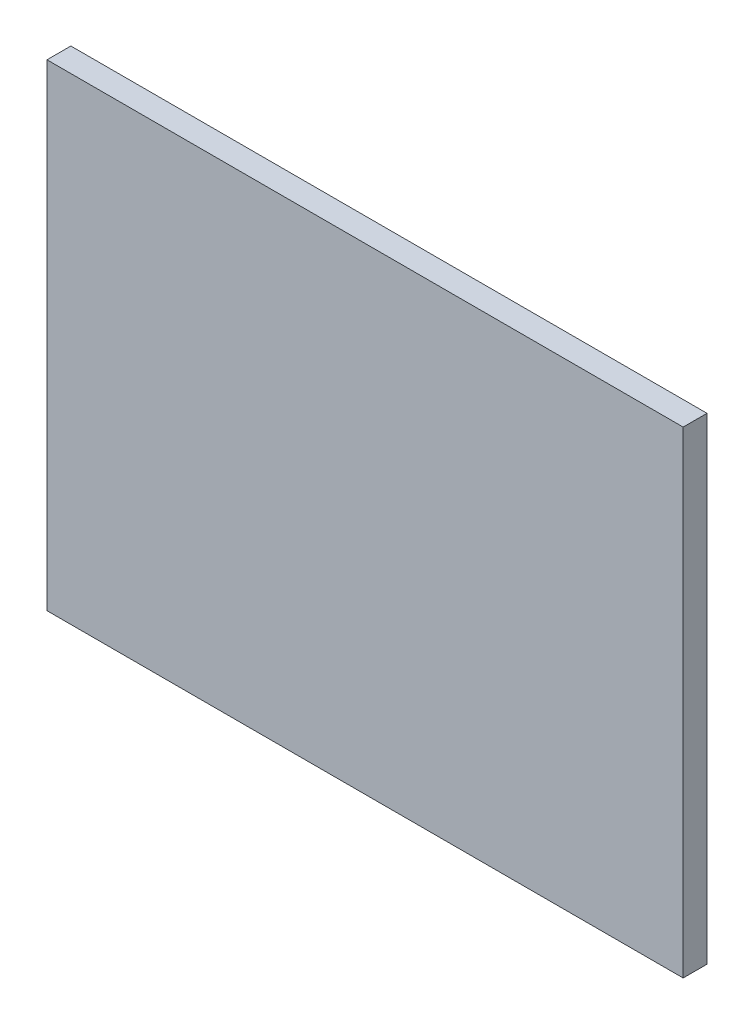
ISO-10303-21;
HEADER;
FILE_DESCRIPTION(('STEP AP214'),'2;1');
FILE_NAME('part.step','',(''),(''),'','','');
FILE_SCHEMA(('AUTOMOTIVE_DESIGN { 1 0 10303 214 1 1 1 1 }'));
ENDSEC;
DATA;
#1=APPLICATION_CONTEXT('core data for automotive mechanical design processes');
#2=APPLICATION_PROTOCOL_DEFINITION('international standard','automotive_design',2000,#1);
#3=PRODUCT_CONTEXT('',#1,'mechanical');
#4=PRODUCT('Part','Part','',(#3));
#5=PRODUCT_RELATED_PRODUCT_CATEGORY('part','',(#4));
#6=PRODUCT_DEFINITION_FORMATION('','',#4);
#7=PRODUCT_DEFINITION_CONTEXT('part definition',#1,'design');
#8=PRODUCT_DEFINITION('design','',#6,#7);
#9=PRODUCT_DEFINITION_SHAPE('','',#8);
#10=(LENGTH_UNIT() NAMED_UNIT(*) SI_UNIT(.MILLI.,.METRE.));
#11=(NAMED_UNIT(*) PLANE_ANGLE_UNIT() SI_UNIT($,.RADIAN.));
#12=(NAMED_UNIT(*) SI_UNIT($,.STERADIAN.) SOLID_ANGLE_UNIT());
#13=UNCERTAINTY_MEASURE_WITH_UNIT(LENGTH_MEASURE(1.E-05),#10,'distance_accuracy_value','');
#14=(GEOMETRIC_REPRESENTATION_CONTEXT(3) GLOBAL_UNCERTAINTY_ASSIGNED_CONTEXT((#13)) GLOBAL_UNIT_ASSIGNED_CONTEXT((#10,
#11,#12)) REPRESENTATION_CONTEXT('',''));
#15=CARTESIAN_POINT('',(0.,0.,0.));
#16=DIRECTION('',(0.,0.,1.));
#17=DIRECTION('',(1.,0.,0.));
#18=AXIS2_PLACEMENT_3D('',#15,#16,#17);
#19=CARTESIAN_POINT('',(-67.0187252741451,-15.3482021871388,3.));
#20=DIRECTION('',(1.,0.,0.));
#21=DIRECTION('',(0.,1.,0.));
#22=AXIS2_PLACEMENT_3D('',#19,#20,#21);
#23=PLANE('',#22);
#24=DIRECTION('',(0.,-1.,0.));
#25=VECTOR('',#24,1.);
#26=CARTESIAN_POINT('',(-67.0187252741451,-15.3482021871388,0.));
#27=LINE('',#26,#25);
#28=CARTESIAN_POINT('',(-67.0187252741451,44.6517978128612,0.));
#29=VERTEX_POINT('',#28);
#30=CARTESIAN_POINT('',(-67.0187252741451,-15.3482021871388,0.));
#31=VERTEX_POINT('',#30);
#32=EDGE_CURVE('E98',#29,#31,#27,.T.);
#33=ORIENTED_EDGE('',*,*,#32,.T.);
#34=DIRECTION('',(0.,0.,-1.));
#35=VECTOR('',#34,1.);
#36=CARTESIAN_POINT('',(-67.0187252741451,-15.3482021871388,3.));
#37=LINE('',#36,#35);
#38=CARTESIAN_POINT('',(-67.0187252741451,-15.3482021871388,3.));
#39=VERTEX_POINT('',#38);
#40=EDGE_CURVE('E11',#39,#31,#37,.T.);
#41=ORIENTED_EDGE('',*,*,#40,.F.);
#42=DIRECTION('',(0.,-1.,0.));
#43=VECTOR('',#42,1.);
#44=CARTESIAN_POINT('',(-67.0187252741451,-15.3482021871388,3.));
#45=LINE('',#44,#43);
#46=CARTESIAN_POINT('',(-67.0187252741451,44.6517978128612,3.));
#47=VERTEX_POINT('',#46);
#48=EDGE_CURVE('E86',#47,#39,#45,.T.);
#49=ORIENTED_EDGE('',*,*,#48,.F.);
#50=DIRECTION('',(0.,0.,-1.));
#51=VECTOR('',#50,1.);
#52=CARTESIAN_POINT('',(-67.0187252741451,44.6517978128612,3.));
#53=LINE('',#52,#51);
#54=EDGE_CURVE('E94',#47,#29,#53,.T.);
#55=ORIENTED_EDGE('',*,*,#54,.T.);
#56=EDGE_LOOP('',(#33,#41,#49,#55));
#57=FACE_BOUND('',#56,.T.);
#58=ADVANCED_FACE('F35',(#57),#23,.F.);
#59=CARTESIAN_POINT('',(-67.0187252741451,-15.3482021871388,3.));
#60=DIRECTION('',(0.,1.,0.));
#61=DIRECTION('',(0.,0.,1.));
#62=AXIS2_PLACEMENT_3D('',#59,#60,#61);
#63=PLANE('',#62);
#64=DIRECTION('',(1.,0.,0.));
#65=VECTOR('',#64,1.);
#66=CARTESIAN_POINT('',(-67.0187252741451,-15.3482021871388,0.));
#67=LINE('',#66,#65);
#68=CARTESIAN_POINT('',(12.9812747258549,-15.3482021871388,0.));
#69=VERTEX_POINT('',#68);
#70=EDGE_CURVE('E90',#31,#69,#67,.T.);
#71=ORIENTED_EDGE('',*,*,#70,.T.);
#72=DIRECTION('',(0.,0.,-1.));
#73=VECTOR('',#72,1.);
#74=CARTESIAN_POINT('',(12.9812747258549,-15.3482021871388,3.));
#75=LINE('',#74,#73);
#76=CARTESIAN_POINT('',(12.9812747258549,-15.3482021871388,3.));
#77=VERTEX_POINT('',#76);
#78=EDGE_CURVE('E43',#77,#69,#75,.T.);
#79=ORIENTED_EDGE('',*,*,#78,.F.);
#80=DIRECTION('',(1.,0.,0.));
#81=VECTOR('',#80,1.);
#82=CARTESIAN_POINT('',(-67.0187252741451,-15.3482021871388,3.));
#83=LINE('',#82,#81);
#84=EDGE_CURVE('E81',#39,#77,#83,.T.);
#85=ORIENTED_EDGE('',*,*,#84,.F.);
#86=ORIENTED_EDGE('',*,*,#40,.T.);
#87=EDGE_LOOP('',(#71,#79,#85,#86));
#88=FACE_BOUND('',#87,.T.);
#89=ADVANCED_FACE('F89',(#88),#63,.F.);
#90=CARTESIAN_POINT('',(12.9812747258549,-15.3482021871388,3.));
#91=DIRECTION('',(-1.,0.,0.));
#92=DIRECTION('',(0.,0.,1.));
#93=AXIS2_PLACEMENT_3D('',#90,#91,#92);
#94=PLANE('',#93);
#95=DIRECTION('',(0.,1.,0.));
#96=VECTOR('',#95,1.);
#97=CARTESIAN_POINT('',(12.9812747258549,-15.3482021871388,0.));
#98=LINE('',#97,#96);
#99=CARTESIAN_POINT('',(12.9812747258549,44.6517978128612,0.));
#100=VERTEX_POINT('',#99);
#101=EDGE_CURVE('E68',#69,#100,#98,.T.);
#102=ORIENTED_EDGE('',*,*,#101,.T.);
#103=DIRECTION('',(0.,0.,-1.));
#104=VECTOR('',#103,1.);
#105=CARTESIAN_POINT('',(12.9812747258549,44.6517978128612,3.));
#106=LINE('',#105,#104);
#107=CARTESIAN_POINT('',(12.9812747258549,44.6517978128612,3.));
#108=VERTEX_POINT('',#107);
#109=EDGE_CURVE('E91',#108,#100,#106,.T.);
#110=ORIENTED_EDGE('',*,*,#109,.F.);
#111=DIRECTION('',(0.,1.,0.));
#112=VECTOR('',#111,1.);
#113=CARTESIAN_POINT('',(12.9812747258549,-15.3482021871388,3.));
#114=LINE('',#113,#112);
#115=EDGE_CURVE('E84',#77,#108,#114,.T.);
#116=ORIENTED_EDGE('',*,*,#115,.F.);
#117=ORIENTED_EDGE('',*,*,#78,.T.);
#118=EDGE_LOOP('',(#102,#110,#116,#117));
#119=FACE_BOUND('',#118,.T.);
#120=ADVANCED_FACE('F92',(#119),#94,.F.);
#121=CARTESIAN_POINT('',(-67.0187252741451,44.6517978128612,3.));
#122=DIRECTION('',(0.,-1.,0.));
#123=DIRECTION('',(0.,0.,-1.));
#124=AXIS2_PLACEMENT_3D('',#121,#122,#123);
#125=PLANE('',#124);
#126=DIRECTION('',(-1.,0.,0.));
#127=VECTOR('',#126,1.);
#128=CARTESIAN_POINT('',(-67.0187252741451,44.6517978128612,0.));
#129=LINE('',#128,#127);
#130=EDGE_CURVE('E74',#100,#29,#129,.T.);
#131=ORIENTED_EDGE('',*,*,#130,.T.);
#132=ORIENTED_EDGE('',*,*,#54,.F.);
#133=DIRECTION('',(-1.,0.,0.));
#134=VECTOR('',#133,1.);
#135=CARTESIAN_POINT('',(-67.0187252741451,44.6517978128612,3.));
#136=LINE('',#135,#134);
#137=EDGE_CURVE('E51',#108,#47,#136,.T.);
#138=ORIENTED_EDGE('',*,*,#137,.F.);
#139=ORIENTED_EDGE('',*,*,#109,.T.);
#140=EDGE_LOOP('',(#131,#132,#138,#139));
#141=FACE_BOUND('',#140,.T.);
#142=ADVANCED_FACE('F105',(#141),#125,.F.);
#143=CARTESIAN_POINT('',(0.,0.,3.));
#144=DIRECTION('',(0.,0.,-1.));
#145=DIRECTION('',(-1.,0.,0.));
#146=AXIS2_PLACEMENT_3D('',#143,#144,#145);
#147=PLANE('',#146);
#148=ORIENTED_EDGE('',*,*,#48,.T.);
#149=ORIENTED_EDGE('',*,*,#84,.T.);
#150=ORIENTED_EDGE('',*,*,#115,.T.);
#151=ORIENTED_EDGE('',*,*,#137,.T.);
#152=EDGE_LOOP('',(#148,#149,#150,#151));
#153=FACE_BOUND('',#152,.T.);
#154=ADVANCED_FACE('F82',(#153),#147,.F.);
#155=CARTESIAN_POINT('',(0.,0.,0.));
#156=DIRECTION('',(0.,0.,-1.));
#157=DIRECTION('',(-1.,0.,0.));
#158=AXIS2_PLACEMENT_3D('',#155,#156,#157);
#159=PLANE('',#158);
#160=ORIENTED_EDGE('',*,*,#32,.F.);
#161=ORIENTED_EDGE('',*,*,#130,.F.);
#162=ORIENTED_EDGE('',*,*,#101,.F.);
#163=ORIENTED_EDGE('',*,*,#70,.F.);
#164=EDGE_LOOP('',(#160,#161,#162,#163));
#165=FACE_BOUND('',#164,.T.);
#166=ADVANCED_FACE('F108',(#165),#159,.T.);
#167=CLOSED_SHELL('',(#58,#89,#120,#142,#154,#166));
#168=MANIFOLD_SOLID_BREP('B2',#167);
#169=ADVANCED_BREP_SHAPE_REPRESENTATION('',(#18,#168),#14);
#170=SHAPE_DEFINITION_REPRESENTATION(#9,#169);
ENDSEC;
END-ISO-10303-21;
